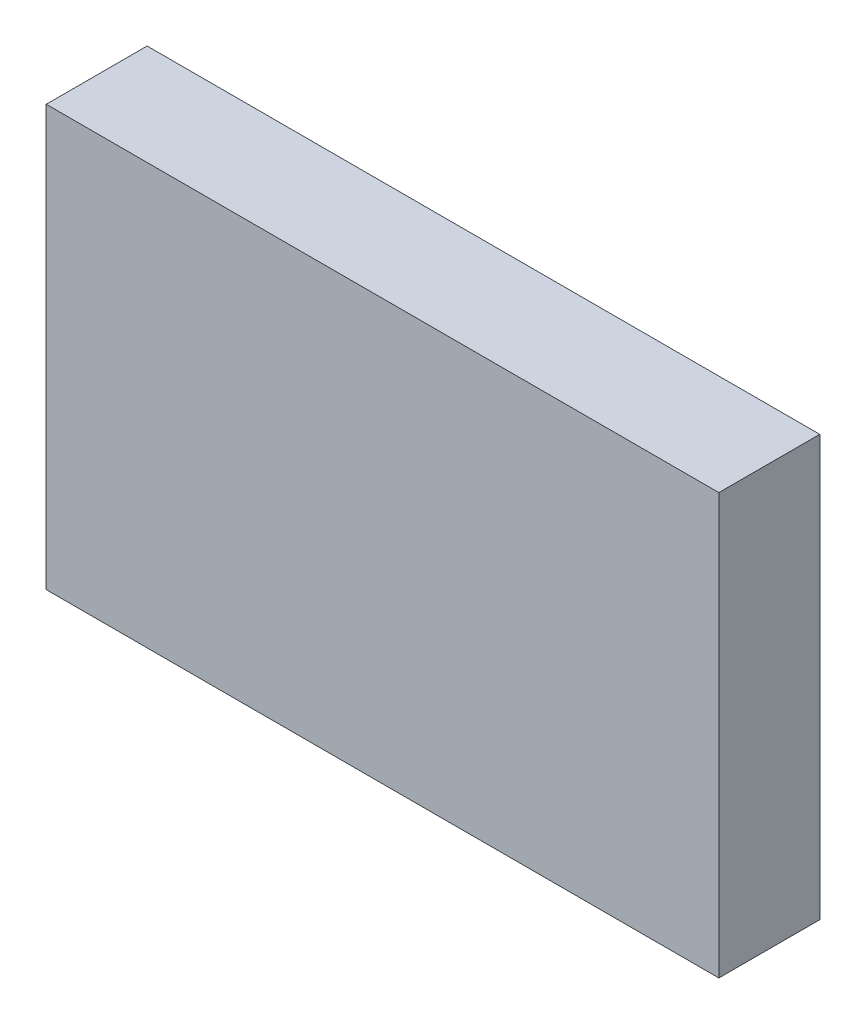
ISO-10303-21;
HEADER;
FILE_DESCRIPTION(('STEP AP214'),'2;1');
FILE_NAME('part.step','',(''),(''),'','','');
FILE_SCHEMA(('AUTOMOTIVE_DESIGN { 1 0 10303 214 1 1 1 1 }'));
ENDSEC;
DATA;
#1=APPLICATION_CONTEXT('core data for automotive mechanical design processes');
#2=APPLICATION_PROTOCOL_DEFINITION('international standard','automotive_design',2000,#1);
#3=PRODUCT_CONTEXT('',#1,'mechanical');
#4=PRODUCT('Part','Part','',(#3));
#5=PRODUCT_RELATED_PRODUCT_CATEGORY('part','',(#4));
#6=PRODUCT_DEFINITION_FORMATION('','',#4);
#7=PRODUCT_DEFINITION_CONTEXT('part definition',#1,'design');
#8=PRODUCT_DEFINITION('design','',#6,#7);
#9=PRODUCT_DEFINITION_SHAPE('','',#8);
#10=(LENGTH_UNIT() NAMED_UNIT(*) SI_UNIT(.MILLI.,.METRE.));
#11=(NAMED_UNIT(*) PLANE_ANGLE_UNIT() SI_UNIT($,.RADIAN.));
#12=(NAMED_UNIT(*) SI_UNIT($,.STERADIAN.) SOLID_ANGLE_UNIT());
#13=UNCERTAINTY_MEASURE_WITH_UNIT(LENGTH_MEASURE(1.E-05),#10,'distance_accuracy_value','');
#14=(GEOMETRIC_REPRESENTATION_CONTEXT(3) GLOBAL_UNCERTAINTY_ASSIGNED_CONTEXT((#13)) GLOBAL_UNIT_ASSIGNED_CONTEXT((#10,
#11,#12)) REPRESENTATION_CONTEXT('',''));
#15=CARTESIAN_POINT('',(0.,0.,0.));
#16=DIRECTION('',(0.,0.,1.));
#17=DIRECTION('',(1.,0.,0.));
#18=AXIS2_PLACEMENT_3D('',#15,#16,#17);
#19=CARTESIAN_POINT('',(0.,50.,12.));
#20=DIRECTION('',(0.,-1.,0.));
#21=DIRECTION('',(0.,0.,-1.));
#22=AXIS2_PLACEMENT_3D('',#19,#20,#21);
#23=PLANE('',#22);
#24=DIRECTION('',(-1.,0.,0.));
#25=VECTOR('',#24,1.);
#26=CARTESIAN_POINT('',(0.,50.,0.));
#27=LINE('',#26,#25);
#28=CARTESIAN_POINT('',(80.,50.,0.));
#29=VERTEX_POINT('',#28);
#30=CARTESIAN_POINT('',(0.,50.,0.));
#31=VERTEX_POINT('',#30);
#32=EDGE_CURVE('E71',#29,#31,#27,.T.);
#33=ORIENTED_EDGE('',*,*,#32,.T.);
#34=DIRECTION('',(0.,0.,-1.));
#35=VECTOR('',#34,1.);
#36=CARTESIAN_POINT('',(0.,50.,12.));
#37=LINE('',#36,#35);
#38=CARTESIAN_POINT('',(0.,50.,12.));
#39=VERTEX_POINT('',#38);
#40=EDGE_CURVE('E82',#39,#31,#37,.T.);
#41=ORIENTED_EDGE('',*,*,#40,.F.);
#42=DIRECTION('',(-1.,0.,0.));
#43=VECTOR('',#42,1.);
#44=CARTESIAN_POINT('',(0.,50.,12.));
#45=LINE('',#44,#43);
#46=CARTESIAN_POINT('',(80.,50.,12.));
#47=VERTEX_POINT('',#46);
#48=EDGE_CURVE('E67',#47,#39,#45,.T.);
#49=ORIENTED_EDGE('',*,*,#48,.F.);
#50=DIRECTION('',(0.,0.,-1.));
#51=VECTOR('',#50,1.);
#52=CARTESIAN_POINT('',(80.,50.,12.));
#53=LINE('',#52,#51);
#54=EDGE_CURVE('E12',#47,#29,#53,.T.);
#55=ORIENTED_EDGE('',*,*,#54,.T.);
#56=EDGE_LOOP('',(#33,#41,#49,#55));
#57=FACE_BOUND('',#56,.T.);
#58=ADVANCED_FACE('F62',(#57),#23,.F.);
#59=OPEN_SHELL('',(#58));
#60=SHELL_BASED_SURFACE_MODEL('B2',(#59));
#61=CARTESIAN_POINT('',(0.,0.,12.));
#62=DIRECTION('',(0.,0.,-1.));
#63=DIRECTION('',(-1.,0.,0.));
#64=AXIS2_PLACEMENT_3D('',#61,#62,#63);
#65=PLANE('',#64);
#66=DIRECTION('',(0.,-1.,0.));
#67=VECTOR('',#66,1.);
#68=CARTESIAN_POINT('',(0.,0.,12.));
#69=LINE('',#68,#67);
#70=CARTESIAN_POINT('',(0.,50.,12.));
#71=VERTEX_POINT('',#70);
#72=CARTESIAN_POINT('',(0.,0.,12.));
#73=VERTEX_POINT('',#72);
#74=EDGE_CURVE('E157',#71,#73,#69,.T.);
#75=ORIENTED_EDGE('',*,*,#74,.T.);
#76=DIRECTION('',(1.,0.,0.));
#77=VECTOR('',#76,1.);
#78=CARTESIAN_POINT('',(0.,0.,12.));
#79=LINE('',#78,#77);
#80=CARTESIAN_POINT('',(80.,0.,12.));
#81=VERTEX_POINT('',#80);
#82=EDGE_CURVE('E150',#73,#81,#79,.T.);
#83=ORIENTED_EDGE('',*,*,#82,.T.);
#84=DIRECTION('',(0.,1.,0.));
#85=VECTOR('',#84,1.);
#86=CARTESIAN_POINT('',(80.,0.,12.));
#87=LINE('',#86,#85);
#88=CARTESIAN_POINT('',(80.,50.,12.));
#89=VERTEX_POINT('',#88);
#90=EDGE_CURVE('E194',#81,#89,#87,.T.);
#91=ORIENTED_EDGE('',*,*,#90,.T.);
#92=DIRECTION('',(-1.,0.,0.));
#93=VECTOR('',#92,1.);
#94=CARTESIAN_POINT('',(0.,50.,12.));
#95=LINE('',#94,#93);
#96=EDGE_CURVE('E60',#89,#71,#95,.T.);
#97=ORIENTED_EDGE('',*,*,#96,.T.);
#98=EDGE_LOOP('',(#75,#83,#91,#97));
#99=FACE_BOUND('',#98,.T.);
#100=ADVANCED_FACE('F144',(#99),#65,.F.);
#101=CARTESIAN_POINT('',(0.,0.,12.));
#102=DIRECTION('',(0.,1.,0.));
#103=DIRECTION('',(0.,0.,1.));
#104=AXIS2_PLACEMENT_3D('',#101,#102,#103);
#105=PLANE('',#104);
#106=DIRECTION('',(1.,0.,0.));
#107=VECTOR('',#106,1.);
#108=CARTESIAN_POINT('',(0.,0.,0.));
#109=LINE('',#108,#107);
#110=CARTESIAN_POINT('',(0.,0.,0.));
#111=VERTEX_POINT('',#110);
#112=CARTESIAN_POINT('',(80.,0.,0.));
#113=VERTEX_POINT('',#112);
#114=EDGE_CURVE('E201',#111,#113,#109,.T.);
#115=ORIENTED_EDGE('',*,*,#114,.T.);
#116=DIRECTION('',(0.,0.,-1.));
#117=VECTOR('',#116,1.);
#118=CARTESIAN_POINT('',(80.,0.,12.));
#119=LINE('',#118,#117);
#120=EDGE_CURVE('E187',#81,#113,#119,.T.);
#121=ORIENTED_EDGE('',*,*,#120,.F.);
#122=ORIENTED_EDGE('',*,*,#82,.F.);
#123=DIRECTION('',(0.,0.,-1.));
#124=VECTOR('',#123,1.);
#125=CARTESIAN_POINT('',(0.,0.,12.));
#126=LINE('',#125,#124);
#127=EDGE_CURVE('E162',#73,#111,#126,.T.);
#128=ORIENTED_EDGE('',*,*,#127,.T.);
#129=EDGE_LOOP('',(#115,#121,#122,#128));
#130=FACE_BOUND('',#129,.T.);
#131=ADVANCED_FACE('F219',(#130),#105,.F.);
#132=CARTESIAN_POINT('',(0.,0.,12.));
#133=DIRECTION('',(1.,0.,0.));
#134=DIRECTION('',(0.,0.,-1.));
#135=AXIS2_PLACEMENT_3D('',#132,#133,#134);
#136=PLANE('',#135);
#137=DIRECTION('',(0.,-1.,0.));
#138=VECTOR('',#137,1.);
#139=CARTESIAN_POINT('',(0.,0.,0.));
#140=LINE('',#139,#138);
#141=CARTESIAN_POINT('',(0.,50.,0.));
#142=VERTEX_POINT('',#141);
#143=EDGE_CURVE('E199',#142,#111,#140,.T.);
#144=ORIENTED_EDGE('',*,*,#143,.T.);
#145=ORIENTED_EDGE('',*,*,#127,.F.);
#146=ORIENTED_EDGE('',*,*,#74,.F.);
#147=DIRECTION('',(0.,0.,-1.));
#148=VECTOR('',#147,1.);
#149=CARTESIAN_POINT('',(0.,50.,12.));
#150=LINE('',#149,#148);
#151=EDGE_CURVE('E213',#71,#142,#150,.T.);
#152=ORIENTED_EDGE('',*,*,#151,.T.);
#153=EDGE_LOOP('',(#144,#145,#146,#152));
#154=FACE_BOUND('',#153,.T.);
#155=ADVANCED_FACE('F222',(#154),#136,.F.);
#156=CARTESIAN_POINT('',(0.,0.,0.));
#157=DIRECTION('',(0.,0.,-1.));
#158=DIRECTION('',(-1.,0.,0.));
#159=AXIS2_PLACEMENT_3D('',#156,#157,#158);
#160=PLANE('',#159);
#161=ORIENTED_EDGE('',*,*,#143,.F.);
#162=DIRECTION('',(-1.,0.,0.));
#163=VECTOR('',#162,1.);
#164=CARTESIAN_POINT('',(0.,50.,0.));
#165=LINE('',#164,#163);
#166=CARTESIAN_POINT('',(80.,50.,0.));
#167=VERTEX_POINT('',#166);
#168=EDGE_CURVE('E197',#167,#142,#165,.T.);
#169=ORIENTED_EDGE('',*,*,#168,.F.);
#170=DIRECTION('',(0.,1.,0.));
#171=VECTOR('',#170,1.);
#172=CARTESIAN_POINT('',(80.,0.,0.));
#173=LINE('',#172,#171);
#174=EDGE_CURVE('E181',#113,#167,#173,.T.);
#175=ORIENTED_EDGE('',*,*,#174,.F.);
#176=ORIENTED_EDGE('',*,*,#114,.F.);
#177=EDGE_LOOP('',(#161,#169,#175,#176));
#178=FACE_BOUND('',#177,.T.);
#179=ADVANCED_FACE('F198',(#178),#160,.T.);
#180=CARTESIAN_POINT('',(80.,0.,12.));
#181=DIRECTION('',(-1.,0.,0.));
#182=DIRECTION('',(0.,0.,1.));
#183=AXIS2_PLACEMENT_3D('',#180,#181,#182);
#184=PLANE('',#183);
#185=ORIENTED_EDGE('',*,*,#174,.T.);
#186=DIRECTION('',(0.,0.,-1.));
#187=VECTOR('',#186,1.);
#188=CARTESIAN_POINT('',(80.,50.,12.));
#189=LINE('',#188,#187);
#190=EDGE_CURVE('E184',#89,#167,#189,.T.);
#191=ORIENTED_EDGE('',*,*,#190,.F.);
#192=ORIENTED_EDGE('',*,*,#90,.F.);
#193=ORIENTED_EDGE('',*,*,#120,.T.);
#194=EDGE_LOOP('',(#185,#191,#192,#193));
#195=FACE_BOUND('',#194,.T.);
#196=ADVANCED_FACE('F183',(#195),#184,.F.);
#197=OPEN_SHELL('',(#100,#131,#155,#179,#196));
#198=SHELL_BASED_SURFACE_MODEL('B6',(#197));
#199=CARTESIAN_POINT('',(0.,0.,12.));
#200=DIRECTION('',(1.,0.,0.));
#201=DIRECTION('',(0.,0.,-1.));
#202=AXIS2_PLACEMENT_3D('',#199,#200,#201);
#203=PLANE('',#202);
#204=DIRECTION('',(0.,-1.,0.));
#205=VECTOR('',#204,1.);
#206=CARTESIAN_POINT('',(0.,0.,0.));
#207=LINE('',#206,#205);
#208=CARTESIAN_POINT('',(0.,50.,0.));
#209=VERTEX_POINT('',#208);
#210=CARTESIAN_POINT('',(0.,0.,0.));
#211=VERTEX_POINT('',#210);
#212=EDGE_CURVE('E381',#209,#211,#207,.T.);
#213=ORIENTED_EDGE('',*,*,#212,.T.);
#214=DIRECTION('',(0.,0.,-1.));
#215=VECTOR('',#214,1.);
#216=CARTESIAN_POINT('',(0.,0.,12.));
#217=LINE('',#216,#215);
#218=CARTESIAN_POINT('',(0.,0.,12.));
#219=VERTEX_POINT('',#218);
#220=EDGE_CURVE('E142',#219,#211,#217,.T.);
#221=ORIENTED_EDGE('',*,*,#220,.F.);
#222=DIRECTION('',(0.,-1.,0.));
#223=VECTOR('',#222,1.);
#224=CARTESIAN_POINT('',(0.,0.,12.));
#225=LINE('',#224,#223);
#226=CARTESIAN_POINT('',(0.,50.,12.));
#227=VERTEX_POINT('',#226);
#228=EDGE_CURVE('E365',#227,#219,#225,.T.);
#229=ORIENTED_EDGE('',*,*,#228,.F.);
#230=DIRECTION('',(0.,0.,-1.));
#231=VECTOR('',#230,1.);
#232=CARTESIAN_POINT('',(0.,50.,12.));
#233=LINE('',#232,#231);
#234=EDGE_CURVE('E377',#227,#209,#233,.T.);
#235=ORIENTED_EDGE('',*,*,#234,.T.);
#236=EDGE_LOOP('',(#213,#221,#229,#235));
#237=FACE_BOUND('',#236,.T.);
#238=ADVANCED_FACE('F313',(#237),#203,.F.);
#239=CARTESIAN_POINT('',(0.,0.,12.));
#240=DIRECTION('',(0.,1.,0.));
#241=DIRECTION('',(0.,0.,1.));
#242=AXIS2_PLACEMENT_3D('',#239,#240,#241);
#243=PLANE('',#242);
#244=DIRECTION('',(1.,0.,0.));
#245=VECTOR('',#244,1.);
#246=CARTESIAN_POINT('',(0.,0.,0.));
#247=LINE('',#246,#245);
#248=CARTESIAN_POINT('',(80.,0.,0.));
#249=VERTEX_POINT('',#248);
#250=EDGE_CURVE('E370',#211,#249,#247,.T.);
#251=ORIENTED_EDGE('',*,*,#250,.T.);
#252=DIRECTION('',(0.,0.,-1.));
#253=VECTOR('',#252,1.);
#254=CARTESIAN_POINT('',(80.,0.,12.));
#255=LINE('',#254,#253);
#256=CARTESIAN_POINT('',(80.,0.,12.));
#257=VERTEX_POINT('',#256);
#258=EDGE_CURVE('E322',#257,#249,#255,.T.);
#259=ORIENTED_EDGE('',*,*,#258,.F.);
#260=DIRECTION('',(1.,0.,0.));
#261=VECTOR('',#260,1.);
#262=CARTESIAN_POINT('',(0.,0.,12.));
#263=LINE('',#262,#261);
#264=EDGE_CURVE('E360',#219,#257,#263,.T.);
#265=ORIENTED_EDGE('',*,*,#264,.F.);
#266=ORIENTED_EDGE('',*,*,#220,.T.);
#267=EDGE_LOOP('',(#251,#259,#265,#266));
#268=FACE_BOUND('',#267,.T.);
#269=ADVANCED_FACE('F369',(#268),#243,.F.);
#270=CARTESIAN_POINT('',(80.,0.,12.));
#271=DIRECTION('',(-1.,0.,0.));
#272=DIRECTION('',(0.,0.,1.));
#273=AXIS2_PLACEMENT_3D('',#270,#271,#272);
#274=PLANE('',#273);
#275=DIRECTION('',(0.,1.,0.));
#276=VECTOR('',#275,1.);
#277=CARTESIAN_POINT('',(80.,0.,0.));
#278=LINE('',#277,#276);
#279=CARTESIAN_POINT('',(80.,50.,0.));
#280=VERTEX_POINT('',#279);
#281=EDGE_CURVE('E347',#249,#280,#278,.T.);
#282=ORIENTED_EDGE('',*,*,#281,.T.);
#283=DIRECTION('',(0.,0.,-1.));
#284=VECTOR('',#283,1.);
#285=CARTESIAN_POINT('',(80.,50.,12.));
#286=LINE('',#285,#284);
#287=CARTESIAN_POINT('',(80.,50.,12.));
#288=VERTEX_POINT('',#287);
#289=EDGE_CURVE('E372',#288,#280,#286,.T.);
#290=ORIENTED_EDGE('',*,*,#289,.F.);
#291=DIRECTION('',(0.,1.,0.));
#292=VECTOR('',#291,1.);
#293=CARTESIAN_POINT('',(80.,0.,12.));
#294=LINE('',#293,#292);
#295=EDGE_CURVE('E363',#257,#288,#294,.T.);
#296=ORIENTED_EDGE('',*,*,#295,.F.);
#297=ORIENTED_EDGE('',*,*,#258,.T.);
#298=EDGE_LOOP('',(#282,#290,#296,#297));
#299=FACE_BOUND('',#298,.T.);
#300=ADVANCED_FACE('F373',(#299),#274,.F.);
#301=CARTESIAN_POINT('',(0.,50.,12.));
#302=DIRECTION('',(0.,-1.,0.));
#303=DIRECTION('',(0.,0.,-1.));
#304=AXIS2_PLACEMENT_3D('',#301,#302,#303);
#305=PLANE('',#304);
#306=DIRECTION('',(-1.,0.,0.));
#307=VECTOR('',#306,1.);
#308=CARTESIAN_POINT('',(0.,50.,0.));
#309=LINE('',#308,#307);
#310=EDGE_CURVE('E353',#280,#209,#309,.T.);
#311=ORIENTED_EDGE('',*,*,#310,.T.);
#312=ORIENTED_EDGE('',*,*,#234,.F.);
#313=DIRECTION('',(-1.,0.,0.));
#314=VECTOR('',#313,1.);
#315=CARTESIAN_POINT('',(0.,50.,12.));
#316=LINE('',#315,#314);
#317=EDGE_CURVE('E330',#288,#227,#316,.T.);
#318=ORIENTED_EDGE('',*,*,#317,.F.);
#319=ORIENTED_EDGE('',*,*,#289,.T.);
#320=EDGE_LOOP('',(#311,#312,#318,#319));
#321=FACE_BOUND('',#320,.T.);
#322=ADVANCED_FACE('F395',(#321),#305,.F.);
#323=CARTESIAN_POINT('',(0.,0.,12.));
#324=DIRECTION('',(0.,0.,-1.));
#325=DIRECTION('',(-1.,0.,0.));
#326=AXIS2_PLACEMENT_3D('',#323,#324,#325);
#327=PLANE('',#326);
#328=ORIENTED_EDGE('',*,*,#228,.T.);
#329=ORIENTED_EDGE('',*,*,#264,.T.);
#330=ORIENTED_EDGE('',*,*,#295,.T.);
#331=ORIENTED_EDGE('',*,*,#317,.T.);
#332=EDGE_LOOP('',(#328,#329,#330,#331));
#333=FACE_BOUND('',#332,.T.);
#334=ADVANCED_FACE('F361',(#333),#327,.F.);
#335=CARTESIAN_POINT('',(0.,0.,0.));
#336=DIRECTION('',(0.,0.,-1.));
#337=DIRECTION('',(-1.,0.,0.));
#338=AXIS2_PLACEMENT_3D('',#335,#336,#337);
#339=PLANE('',#338);
#340=ORIENTED_EDGE('',*,*,#212,.F.);
#341=ORIENTED_EDGE('',*,*,#310,.F.);
#342=ORIENTED_EDGE('',*,*,#281,.F.);
#343=ORIENTED_EDGE('',*,*,#250,.F.);
#344=EDGE_LOOP('',(#340,#341,#342,#343));
#345=FACE_BOUND('',#344,.T.);
#346=ADVANCED_FACE('F398',(#345),#339,.T.);
#347=CLOSED_SHELL('',(#238,#269,#300,#322,#334,#346));
#348=MANIFOLD_SOLID_BREP('B54',#347);
#349=ADVANCED_BREP_SHAPE_REPRESENTATION('',(#18,#348),#14);
#350=MANIFOLD_SURFACE_SHAPE_REPRESENTATION('',(#18,#60,#198),#14);
#351=SHAPE_REPRESENTATION('',(#18),#14);
#352=SHAPE_DEFINITION_REPRESENTATION(#9,#351);
#353=SHAPE_REPRESENTATION_RELATIONSHIP('','',#351,#349);
#354=SHAPE_REPRESENTATION_RELATIONSHIP('','',#351,#350);
ENDSEC;
END-ISO-10303-21;
